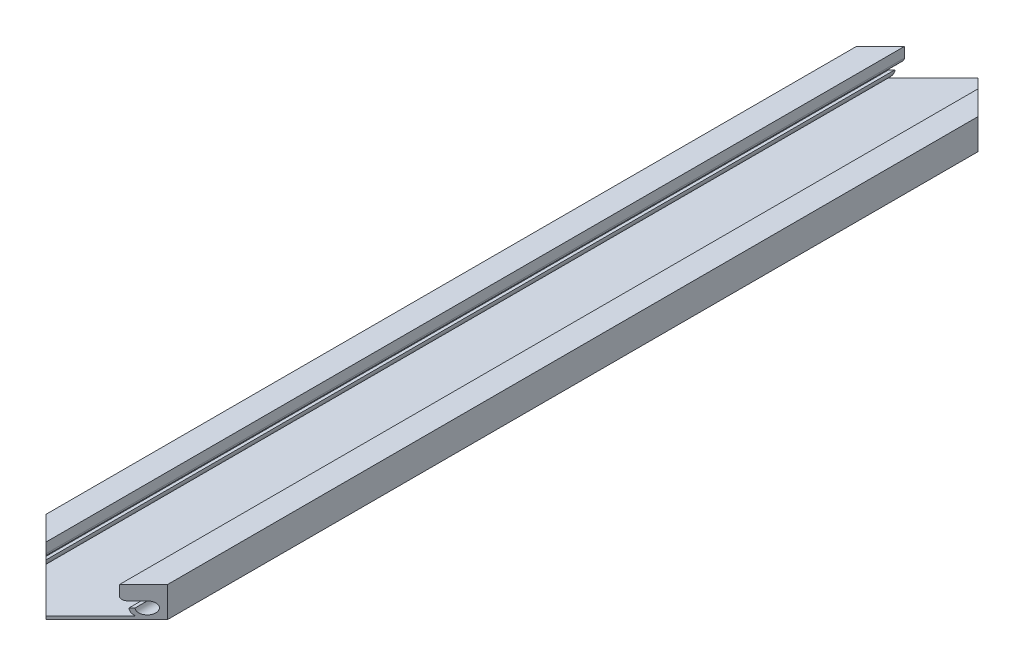
ISO-10303-21;
HEADER;
FILE_DESCRIPTION(('STEP AP214'),'2;1');
FILE_NAME('part.step','',(''),(''),'','','');
FILE_SCHEMA(('AUTOMOTIVE_DESIGN { 1 0 10303 214 1 1 1 1 }'));
ENDSEC;
DATA;
#1=APPLICATION_CONTEXT('core data for automotive mechanical design processes');
#2=APPLICATION_PROTOCOL_DEFINITION('international standard','automotive_design',2000,#1);
#3=PRODUCT_CONTEXT('',#1,'mechanical');
#4=PRODUCT('Part','Part','',(#3));
#5=PRODUCT_RELATED_PRODUCT_CATEGORY('part','',(#4));
#6=PRODUCT_DEFINITION_FORMATION('','',#4);
#7=PRODUCT_DEFINITION_CONTEXT('part definition',#1,'design');
#8=PRODUCT_DEFINITION('design','',#6,#7);
#9=PRODUCT_DEFINITION_SHAPE('','',#8);
#10=(LENGTH_UNIT() NAMED_UNIT(*) SI_UNIT(.MILLI.,.METRE.));
#11=(NAMED_UNIT(*) PLANE_ANGLE_UNIT() SI_UNIT($,.RADIAN.));
#12=(NAMED_UNIT(*) SI_UNIT($,.STERADIAN.) SOLID_ANGLE_UNIT());
#13=UNCERTAINTY_MEASURE_WITH_UNIT(LENGTH_MEASURE(1.E-05),#10,'distance_accuracy_value','');
#14=(GEOMETRIC_REPRESENTATION_CONTEXT(3) GLOBAL_UNCERTAINTY_ASSIGNED_CONTEXT((#13)) GLOBAL_UNIT_ASSIGNED_CONTEXT((#10,
#11,#12)) REPRESENTATION_CONTEXT('',''));
#15=CARTESIAN_POINT('',(0.,0.,0.));
#16=DIRECTION('',(0.,0.,1.));
#17=DIRECTION('',(1.,0.,0.));
#18=AXIS2_PLACEMENT_3D('',#15,#16,#17);
#19=CARTESIAN_POINT('',(-30.,-7.5,460.));
#20=DIRECTION('',(0.,1.,0.));
#21=DIRECTION('',(0.,0.,1.));
#22=AXIS2_PLACEMENT_3D('',#19,#20,#21);
#23=PLANE('',#22);
#24=DIRECTION('',(-0.707106781186552,0.,0.707106781186543));
#25=VECTOR('',#24,1.);
#26=CARTESIAN_POINT('',(230.,-7.5,230.000000000003));
#27=LINE('',#26,#25);
#28=CARTESIAN_POINT('',(30.,-7.5,430.000000000001));
#29=VERTEX_POINT('',#28);
#30=CARTESIAN_POINT('',(0.,-7.5,460.));
#31=VERTEX_POINT('',#30);
#32=EDGE_CURVE('E362',#29,#31,#27,.T.);
#33=ORIENTED_EDGE('',*,*,#32,.T.);
#34=DIRECTION('',(0.707106781186552,0.,0.707106781186543));
#35=VECTOR('',#34,1.);
#36=CARTESIAN_POINT('',(-230.,-7.5,230.000000000003));
#37=LINE('',#36,#35);
#38=CARTESIAN_POINT('',(-30.,-7.5,430.));
#39=VERTEX_POINT('',#38);
#40=EDGE_CURVE('E228',#39,#31,#37,.T.);
#41=ORIENTED_EDGE('',*,*,#40,.F.);
#42=DIRECTION('',(0.,0.,-1.));
#43=VECTOR('',#42,1.);
#44=CARTESIAN_POINT('',(-30.,-7.5,460.));
#45=LINE('',#44,#43);
#46=CARTESIAN_POINT('',(-30.,-7.5,29.9999999999996));
#47=VERTEX_POINT('',#46);
#48=EDGE_CURVE('E237',#39,#47,#45,.T.);
#49=ORIENTED_EDGE('',*,*,#48,.T.);
#50=DIRECTION('',(0.707106781186552,0.,-0.707106781186543));
#51=VECTOR('',#50,1.);
#52=CARTESIAN_POINT('',(0.,-7.5,0.));
#53=LINE('',#52,#51);
#54=CARTESIAN_POINT('',(0.,-7.5,0.));
#55=VERTEX_POINT('',#54);
#56=EDGE_CURVE('E366',#47,#55,#53,.T.);
#57=ORIENTED_EDGE('',*,*,#56,.T.);
#58=DIRECTION('',(-0.707106781186552,0.,-0.707106781186543));
#59=VECTOR('',#58,1.);
#60=CARTESIAN_POINT('',(0.,-7.5,0.));
#61=LINE('',#60,#59);
#62=CARTESIAN_POINT('',(30.,-7.5,29.9999999999996));
#63=VERTEX_POINT('',#62);
#64=EDGE_CURVE('E365',#63,#55,#61,.T.);
#65=ORIENTED_EDGE('',*,*,#64,.F.);
#66=DIRECTION('',(0.,0.,-1.));
#67=VECTOR('',#66,1.);
#68=CARTESIAN_POINT('',(30.,-7.5,460.));
#69=LINE('',#68,#67);
#70=EDGE_CURVE('E252',#29,#63,#69,.T.);
#71=ORIENTED_EDGE('',*,*,#70,.F.);
#72=EDGE_LOOP('',(#33,#41,#49,#57,#65,#71));
#73=FACE_BOUND('',#72,.T.);
#74=ADVANCED_FACE('F80',(#73),#23,.F.);
#75=CARTESIAN_POINT('',(22.1715728752538,-6.,460.));
#76=DIRECTION('',(0.,-1.,0.));
#77=DIRECTION('',(0.,0.,-1.));
#78=AXIS2_PLACEMENT_3D('',#75,#76,#77);
#79=PLANE('',#78);
#80=DIRECTION('',(0.,0.,-1.));
#81=VECTOR('',#80,1.);
#82=CARTESIAN_POINT('',(-22.1715728752538,-6.,460.));
#83=LINE('',#82,#81);
#84=CARTESIAN_POINT('',(-22.1715728752538,-6.,437.828427124747));
#85=VERTEX_POINT('',#84);
#86=CARTESIAN_POINT('',(-22.1715728752538,-6.,22.1715728752536));
#87=VERTEX_POINT('',#86);
#88=EDGE_CURVE('E343',#85,#87,#83,.T.);
#89=ORIENTED_EDGE('',*,*,#88,.F.);
#90=DIRECTION('',(0.707106781186552,0.,0.707106781186543));
#91=VECTOR('',#90,1.);
#92=CARTESIAN_POINT('',(11.085786437627,-6.,471.085786437627));
#93=LINE('',#92,#91);
#94=CARTESIAN_POINT('',(0.,-6.,460.));
#95=VERTEX_POINT('',#94);
#96=EDGE_CURVE('E417',#85,#95,#93,.T.);
#97=ORIENTED_EDGE('',*,*,#96,.T.);
#98=DIRECTION('',(-0.707106781186552,0.,0.707106781186543));
#99=VECTOR('',#98,1.);
#100=CARTESIAN_POINT('',(11.0857864376271,-6.,448.914213562373));
#101=LINE('',#100,#99);
#102=CARTESIAN_POINT('',(22.1715728752538,-6.,437.828427124747));
#103=VERTEX_POINT('',#102);
#104=EDGE_CURVE('E320',#103,#95,#101,.T.);
#105=ORIENTED_EDGE('',*,*,#104,.F.);
#106=DIRECTION('',(0.,0.,-1.));
#107=VECTOR('',#106,1.);
#108=CARTESIAN_POINT('',(22.1715728752538,-6.,460.));
#109=LINE('',#108,#107);
#110=CARTESIAN_POINT('',(22.1715728752538,-6.,22.1715728752536));
#111=VERTEX_POINT('',#110);
#112=EDGE_CURVE('E326',#103,#111,#109,.T.);
#113=ORIENTED_EDGE('',*,*,#112,.T.);
#114=DIRECTION('',(-0.707106781186552,0.,-0.707106781186543));
#115=VECTOR('',#114,1.);
#116=CARTESIAN_POINT('',(241.085786437627,-6.,241.085786437624));
#117=LINE('',#116,#115);
#118=CARTESIAN_POINT('',(0.,-6.,0.));
#119=VERTEX_POINT('',#118);
#120=EDGE_CURVE('E311',#111,#119,#117,.T.);
#121=ORIENTED_EDGE('',*,*,#120,.T.);
#122=DIRECTION('',(0.707106781186552,0.,-0.707106781186543));
#123=VECTOR('',#122,1.);
#124=CARTESIAN_POINT('',(-218.914213562373,-6.,218.91421356237));
#125=LINE('',#124,#123);
#126=EDGE_CURVE('E370',#87,#119,#125,.T.);
#127=ORIENTED_EDGE('',*,*,#126,.F.);
#128=EDGE_LOOP('',(#89,#97,#105,#113,#121,#127));
#129=FACE_BOUND('',#128,.T.);
#130=ADVANCED_FACE('F402',(#129),#79,.F.);
#131=CARTESIAN_POINT('',(-30.,7.5,460.));
#132=DIRECTION('',(0.,-1.,0.));
#133=DIRECTION('',(0.,0.,-1.));
#134=AXIS2_PLACEMENT_3D('',#131,#132,#133);
#135=PLANE('',#134);
#136=DIRECTION('',(0.,0.,-1.));
#137=VECTOR('',#136,1.);
#138=CARTESIAN_POINT('',(-30.,7.5,460.));
#139=LINE('',#138,#137);
#140=CARTESIAN_POINT('',(-30.,7.5,430.));
#141=VERTEX_POINT('',#140);
#142=CARTESIAN_POINT('',(-30.,7.5,29.9999999999996));
#143=VERTEX_POINT('',#142);
#144=EDGE_CURVE('E235',#141,#143,#139,.T.);
#145=ORIENTED_EDGE('',*,*,#144,.F.);
#146=DIRECTION('',(0.707106781186552,0.,0.707106781186543));
#147=VECTOR('',#146,1.);
#148=CARTESIAN_POINT('',(-230.,7.5,230.000000000003));
#149=LINE('',#148,#147);
#150=CARTESIAN_POINT('',(-18.1568883594902,7.5,441.84311164051));
#151=VERTEX_POINT('',#150);
#152=EDGE_CURVE('E216',#141,#151,#149,.T.);
#153=ORIENTED_EDGE('',*,*,#152,.T.);
#154=DIRECTION('',(0.,0.,-1.));
#155=VECTOR('',#154,1.);
#156=CARTESIAN_POINT('',(-18.1568883594903,7.5,460.));
#157=LINE('',#156,#155);
#158=CARTESIAN_POINT('',(-18.1568883594903,7.5,18.1568883594901));
#159=VERTEX_POINT('',#158);
#160=EDGE_CURVE('E323',#151,#159,#157,.T.);
#161=ORIENTED_EDGE('',*,*,#160,.T.);
#162=DIRECTION('',(0.707106781186552,0.,-0.707106781186543));
#163=VECTOR('',#162,1.);
#164=CARTESIAN_POINT('',(0.,7.5,0.));
#165=LINE('',#164,#163);
#166=EDGE_CURVE('E243',#143,#159,#165,.T.);
#167=ORIENTED_EDGE('',*,*,#166,.F.);
#168=EDGE_LOOP('',(#145,#153,#161,#167));
#169=FACE_BOUND('',#168,.T.);
#170=ADVANCED_FACE('F242',(#169),#135,.F.);
#171=CARTESIAN_POINT('',(25.,0.5,460.));
#172=DIRECTION('',(0.,1.,0.));
#173=DIRECTION('',(-1.,0.,0.));
#174=AXIS2_PLACEMENT_3D('',#171,#172,#173);
#175=PLANE('',#174);
#176=DIRECTION('',(0.,0.,-1.));
#177=VECTOR('',#176,1.);
#178=CARTESIAN_POINT('',(-20.1568883594903,0.5,460.));
#179=LINE('',#178,#177);
#180=CARTESIAN_POINT('',(-20.1568883594903,0.5,20.1568883594901));
#181=VERTEX_POINT('',#180);
#182=CARTESIAN_POINT('',(-20.1568883594903,0.5,439.84311164051));
#183=VERTEX_POINT('',#182);
#184=EDGE_CURVE('E267',#181,#183,#179,.F.);
#185=ORIENTED_EDGE('',*,*,#184,.T.);
#186=DIRECTION('',(-0.707106781186552,0.,-0.707106781186543));
#187=VECTOR('',#186,1.);
#188=CARTESIAN_POINT('',(12.5000000000001,0.5,472.5));
#189=LINE('',#188,#187);
#190=CARTESIAN_POINT('',(-25.,0.5,435.));
#191=VERTEX_POINT('',#190);
#192=EDGE_CURVE('E466',#183,#191,#189,.T.);
#193=ORIENTED_EDGE('',*,*,#192,.T.);
#194=DIRECTION('',(0.,0.,-1.));
#195=VECTOR('',#194,1.);
#196=CARTESIAN_POINT('',(-25.,0.5,460.));
#197=LINE('',#196,#195);
#198=CARTESIAN_POINT('',(-25.,0.5,24.9999999999997));
#199=VERTEX_POINT('',#198);
#200=EDGE_CURVE('E335',#191,#199,#197,.T.);
#201=ORIENTED_EDGE('',*,*,#200,.T.);
#202=DIRECTION('',(-0.707106781186552,0.,0.707106781186543));
#203=VECTOR('',#202,1.);
#204=CARTESIAN_POINT('',(-217.5,0.499999999999999,217.499999999997));
#205=LINE('',#204,#203);
#206=EDGE_CURVE('E434',#181,#199,#205,.T.);
#207=ORIENTED_EDGE('',*,*,#206,.F.);
#208=EDGE_LOOP('',(#185,#193,#201,#207));
#209=FACE_BOUND('',#208,.T.);
#210=ADVANCED_FACE('F491',(#209),#175,.F.);
#211=CARTESIAN_POINT('',(-30.,7.5,460.));
#212=DIRECTION('',(1.,0.,0.));
#213=DIRECTION('',(0.,1.,0.));
#214=AXIS2_PLACEMENT_3D('',#211,#212,#213);
#215=PLANE('',#214);
#216=ORIENTED_EDGE('',*,*,#48,.F.);
#217=DIRECTION('',(0.,-1.,0.));
#218=VECTOR('',#217,1.);
#219=CARTESIAN_POINT('',(-30.,7.5,430.));
#220=LINE('',#219,#218);
#221=EDGE_CURVE('E219',#141,#39,#220,.T.);
#222=ORIENTED_EDGE('',*,*,#221,.F.);
#223=ORIENTED_EDGE('',*,*,#144,.T.);
#224=DIRECTION('',(0.,-1.,0.));
#225=VECTOR('',#224,1.);
#226=CARTESIAN_POINT('',(-30.,7.5,29.9999999999996));
#227=LINE('',#226,#225);
#228=EDGE_CURVE('E453',#143,#47,#227,.T.);
#229=ORIENTED_EDGE('',*,*,#228,.T.);
#230=EDGE_LOOP('',(#216,#222,#223,#229));
#231=FACE_BOUND('',#230,.T.);
#232=ADVANCED_FACE('F233',(#231),#215,.F.);
#233=CARTESIAN_POINT('',(-25.,-2.5,460.));
#234=DIRECTION('',(0.,0.,-1.));
#235=DIRECTION('',(-1.,0.,0.));
#236=AXIS2_PLACEMENT_3D('',#233,#234,#235);
#237=CYLINDRICAL_SURFACE('',#236,3.);
#238=ORIENTED_EDGE('',*,*,#200,.F.);
#239=CARTESIAN_POINT('',(-25.,-2.5,435.));
#240=DIRECTION('',(0.707106781186543,0.,-0.707106781186552));
#241=DIRECTION('',(-0.707106781186552,0.,-0.707106781186543));
#242=AXIS2_PLACEMENT_3D('',#239,#240,#241);
#243=ELLIPSE('',#242,4.24264068711926,3.);
#244=CARTESIAN_POINT('',(-22.,-2.5,438.));
#245=VERTEX_POINT('',#244);
#246=EDGE_CURVE('E470',#191,#245,#243,.F.);
#247=ORIENTED_EDGE('',*,*,#246,.T.);
#248=DIRECTION('',(0.,0.,-1.));
#249=VECTOR('',#248,1.);
#250=CARTESIAN_POINT('',(-22.,-2.5,460.));
#251=LINE('',#250,#249);
#252=CARTESIAN_POINT('',(-22.,-2.5,21.9999999999999));
#253=VERTEX_POINT('',#252);
#254=EDGE_CURVE('E259',#245,#253,#251,.T.);
#255=ORIENTED_EDGE('',*,*,#254,.T.);
#256=CARTESIAN_POINT('',(-25.,-2.5,24.9999999999997));
#257=DIRECTION('',(-0.707106781186543,0.,-0.707106781186552));
#258=DIRECTION('',(0.707106781186552,0.,-0.707106781186543));
#259=AXIS2_PLACEMENT_3D('',#256,#257,#258);
#260=ELLIPSE('',#259,4.24264068711927,3.);
#261=EDGE_CURVE('E437',#199,#253,#260,.F.);
#262=ORIENTED_EDGE('',*,*,#261,.F.);
#263=EDGE_LOOP('',(#238,#247,#255,#262));
#264=FACE_BOUND('',#263,.T.);
#265=ADVANCED_FACE('F488',(#264),#237,.F.);
#266=CARTESIAN_POINT('',(-25.,-2.5,460.));
#267=DIRECTION('',(0.,-1.,0.));
#268=DIRECTION('',(1.,0.,0.));
#269=AXIS2_PLACEMENT_3D('',#266,#267,#268);
#270=PLANE('',#269);
#271=ORIENTED_EDGE('',*,*,#254,.F.);
#272=DIRECTION('',(0.707106781186552,0.,0.707106781186543));
#273=VECTOR('',#272,1.);
#274=CARTESIAN_POINT('',(-12.5000000000002,-2.5,447.5));
#275=LINE('',#274,#273);
#276=CARTESIAN_POINT('',(-20.5,-2.5,439.5));
#277=VERTEX_POINT('',#276);
#278=EDGE_CURVE('E428',#245,#277,#275,.T.);
#279=ORIENTED_EDGE('',*,*,#278,.T.);
#280=DIRECTION('',(0.,0.,-1.));
#281=VECTOR('',#280,1.);
#282=CARTESIAN_POINT('',(-20.5,-2.5,460.));
#283=LINE('',#282,#281);
#284=CARTESIAN_POINT('',(-20.5,-2.5,20.4999999999998));
#285=VERTEX_POINT('',#284);
#286=EDGE_CURVE('E339',#277,#285,#283,.T.);
#287=ORIENTED_EDGE('',*,*,#286,.T.);
#288=DIRECTION('',(0.707106781186552,0.,-0.707106781186543));
#289=VECTOR('',#288,1.);
#290=CARTESIAN_POINT('',(-242.5,-2.49999999999994,242.499999999997));
#291=LINE('',#290,#289);
#292=EDGE_CURVE('E440',#253,#285,#291,.T.);
#293=ORIENTED_EDGE('',*,*,#292,.F.);
#294=EDGE_LOOP('',(#271,#279,#287,#293));
#295=FACE_BOUND('',#294,.T.);
#296=ADVANCED_FACE('F478',(#295),#270,.F.);
#297=CARTESIAN_POINT('',(-25.,-2.5,460.));
#298=DIRECTION('',(0.,0.,-1.));
#299=DIRECTION('',(-1.,0.,0.));
#300=AXIS2_PLACEMENT_3D('',#297,#298,#299);
#301=CYLINDRICAL_SURFACE('',#300,4.5);
#302=ORIENTED_EDGE('',*,*,#286,.F.);
#303=CARTESIAN_POINT('',(-25.,-2.5,435.));
#304=DIRECTION('',(0.707106781186543,0.,-0.707106781186552));
#305=DIRECTION('',(-0.707106781186552,0.,-0.707106781186543));
#306=AXIS2_PLACEMENT_3D('',#303,#304,#305);
#307=ELLIPSE('',#306,6.36396103067889,4.5);
#308=EDGE_CURVE('E421',#277,#85,#307,.T.);
#309=ORIENTED_EDGE('',*,*,#308,.T.);
#310=ORIENTED_EDGE('',*,*,#88,.T.);
#311=CARTESIAN_POINT('',(-25.,-2.5,24.9999999999997));
#312=DIRECTION('',(-0.707106781186543,0.,-0.707106781186552));
#313=DIRECTION('',(0.707106781186552,0.,-0.707106781186543));
#314=AXIS2_PLACEMENT_3D('',#311,#312,#313);
#315=ELLIPSE('',#314,6.3639610306789,4.5);
#316=EDGE_CURVE('E375',#285,#87,#315,.T.);
#317=ORIENTED_EDGE('',*,*,#316,.F.);
#318=EDGE_LOOP('',(#302,#309,#310,#317));
#319=FACE_BOUND('',#318,.T.);
#320=ADVANCED_FACE('F482',(#319),#301,.T.);
#321=CARTESIAN_POINT('',(-18.1568883594903,7.5,460.));
#322=DIRECTION('',(-1.,0.,0.));
#323=DIRECTION('',(0.,0.,1.));
#324=AXIS2_PLACEMENT_3D('',#321,#322,#323);
#325=PLANE('',#324);
#326=ORIENTED_EDGE('',*,*,#160,.F.);
#327=DIRECTION('',(0.,-1.,0.));
#328=VECTOR('',#327,1.);
#329=CARTESIAN_POINT('',(-18.1568883594903,7.5,441.84311164051));
#330=LINE('',#329,#328);
#331=CARTESIAN_POINT('',(-18.1568883594903,2.5,441.84311164051));
#332=VERTEX_POINT('',#331);
#333=EDGE_CURVE('E222',#151,#332,#330,.T.);
#334=ORIENTED_EDGE('',*,*,#333,.T.);
#335=DIRECTION('',(0.,0.,-1.));
#336=VECTOR('',#335,1.);
#337=CARTESIAN_POINT('',(-18.1568883594903,2.5,460.));
#338=LINE('',#337,#336);
#339=CARTESIAN_POINT('',(-18.1568883594903,2.5,18.1568883594901));
#340=VERTEX_POINT('',#339);
#341=EDGE_CURVE('E263',#332,#340,#338,.T.);
#342=ORIENTED_EDGE('',*,*,#341,.T.);
#343=DIRECTION('',(0.,-1.,0.));
#344=VECTOR('',#343,1.);
#345=CARTESIAN_POINT('',(-18.1568883594903,7.5,18.1568883594901));
#346=LINE('',#345,#344);
#347=EDGE_CURVE('E426',#159,#340,#346,.T.);
#348=ORIENTED_EDGE('',*,*,#347,.F.);
#349=EDGE_LOOP('',(#326,#334,#342,#348));
#350=FACE_BOUND('',#349,.T.);
#351=ADVANCED_FACE('F498',(#350),#325,.F.);
#352=CARTESIAN_POINT('',(-20.1568883594903,2.5,460.));
#353=DIRECTION('',(0.,0.,-1.));
#354=DIRECTION('',(-1.,0.,0.));
#355=AXIS2_PLACEMENT_3D('',#352,#353,#354);
#356=CYLINDRICAL_SURFACE('',#355,2.);
#357=CARTESIAN_POINT('',(-20.1568883594903,2.5,439.84311164051));
#358=DIRECTION('',(0.707106781186543,0.,-0.707106781186552));
#359=DIRECTION('',(-0.707106781186552,0.,-0.707106781186543));
#360=AXIS2_PLACEMENT_3D('',#357,#358,#359);
#361=ELLIPSE('',#360,2.82842712474617,2.);
#362=EDGE_CURVE('E239',#183,#332,#361,.F.);
#363=ORIENTED_EDGE('',*,*,#362,.F.);
#364=ORIENTED_EDGE('',*,*,#184,.F.);
#365=CARTESIAN_POINT('',(-20.1568883594903,2.5,20.1568883594901));
#366=DIRECTION('',(-0.707106781186543,0.,-0.707106781186552));
#367=DIRECTION('',(0.707106781186552,0.,-0.707106781186543));
#368=AXIS2_PLACEMENT_3D('',#365,#366,#367);
#369=ELLIPSE('',#368,2.82842712474617,2.);
#370=EDGE_CURVE('E420',#181,#340,#369,.F.);
#371=ORIENTED_EDGE('',*,*,#370,.T.);
#372=ORIENTED_EDGE('',*,*,#341,.F.);
#373=EDGE_LOOP('',(#363,#364,#371,#372));
#374=FACE_BOUND('',#373,.T.);
#375=ADVANCED_FACE('F495',(#374),#356,.T.);
#376=CARTESIAN_POINT('',(30.,7.5,460.));
#377=DIRECTION('',(-1.,0.,0.));
#378=DIRECTION('',(0.,-1.,0.));
#379=AXIS2_PLACEMENT_3D('',#376,#377,#378);
#380=PLANE('',#379);
#381=DIRECTION('',(0.,-1.,0.));
#382=VECTOR('',#381,1.);
#383=CARTESIAN_POINT('',(30.,7.5,430.000000000001));
#384=LINE('',#383,#382);
#385=CARTESIAN_POINT('',(30.,7.5,430.000000000001));
#386=VERTEX_POINT('',#385);
#387=EDGE_CURVE('E358',#386,#29,#384,.T.);
#388=ORIENTED_EDGE('',*,*,#387,.T.);
#389=ORIENTED_EDGE('',*,*,#70,.T.);
#390=DIRECTION('',(0.,-1.,0.));
#391=VECTOR('',#390,1.);
#392=CARTESIAN_POINT('',(30.,7.5,29.9999999999996));
#393=LINE('',#392,#391);
#394=CARTESIAN_POINT('',(30.,7.5,29.9999999999996));
#395=VERTEX_POINT('',#394);
#396=EDGE_CURVE('E357',#395,#63,#393,.T.);
#397=ORIENTED_EDGE('',*,*,#396,.F.);
#398=DIRECTION('',(0.,0.,-1.));
#399=VECTOR('',#398,1.);
#400=CARTESIAN_POINT('',(30.,7.5,460.));
#401=LINE('',#400,#399);
#402=EDGE_CURVE('E245',#386,#395,#401,.T.);
#403=ORIENTED_EDGE('',*,*,#402,.F.);
#404=EDGE_LOOP('',(#388,#389,#397,#403));
#405=FACE_BOUND('',#404,.T.);
#406=ADVANCED_FACE('F355',(#405),#380,.F.);
#407=DIRECTION('',(-0.707106781186552,0.,0.707106781186543));
#408=VECTOR('',#407,1.);
#409=CARTESIAN_POINT('',(230.,7.5,230.000000000003));
#410=LINE('',#409,#408);
#411=CARTESIAN_POINT('',(18.1431116405097,7.5,441.856888359491));
#412=VERTEX_POINT('',#411);
#413=EDGE_CURVE('E445',#386,#412,#410,.T.);
#414=ORIENTED_EDGE('',*,*,#413,.F.);
#415=ORIENTED_EDGE('',*,*,#402,.T.);
#416=DIRECTION('',(-0.707106781186552,0.,-0.707106781186543));
#417=VECTOR('',#416,1.);
#418=CARTESIAN_POINT('',(0.,7.5,0.));
#419=LINE('',#418,#417);
#420=CARTESIAN_POINT('',(18.1431116405097,7.5,18.1431116405095));
#421=VERTEX_POINT('',#420);
#422=EDGE_CURVE('E369',#395,#421,#419,.T.);
#423=ORIENTED_EDGE('',*,*,#422,.T.);
#424=DIRECTION('',(0.,0.,-1.));
#425=VECTOR('',#424,1.);
#426=CARTESIAN_POINT('',(18.1431116405097,7.5,460.));
#427=LINE('',#426,#425);
#428=EDGE_CURVE('E290',#412,#421,#427,.T.);
#429=ORIENTED_EDGE('',*,*,#428,.F.);
#430=EDGE_LOOP('',(#414,#415,#423,#429));
#431=FACE_BOUND('',#430,.T.);
#432=ADVANCED_FACE('F520',(#431),#135,.F.);
#433=CARTESIAN_POINT('',(25.,-2.5,460.));
#434=DIRECTION('',(0.,0.,-1.));
#435=DIRECTION('',(-1.,0.,0.));
#436=AXIS2_PLACEMENT_3D('',#433,#434,#435);
#437=CYLINDRICAL_SURFACE('',#436,3.);
#438=CARTESIAN_POINT('',(25.,-2.5,435.));
#439=DIRECTION('',(0.707106781186543,0.,0.707106781186552));
#440=DIRECTION('',(0.707106781186552,0.,-0.707106781186543));
#441=AXIS2_PLACEMENT_3D('',#438,#439,#440);
#442=ELLIPSE('',#441,4.24264068711926,3.);
#443=CARTESIAN_POINT('',(25.,0.5,435.));
#444=VERTEX_POINT('',#443);
#445=CARTESIAN_POINT('',(22.,-2.5,438.));
#446=VERTEX_POINT('',#445);
#447=EDGE_CURVE('E305',#444,#446,#442,.F.);
#448=ORIENTED_EDGE('',*,*,#447,.F.);
#449=DIRECTION('',(0.,0.,-1.));
#450=VECTOR('',#449,1.);
#451=CARTESIAN_POINT('',(25.,0.5,460.));
#452=LINE('',#451,#450);
#453=CARTESIAN_POINT('',(25.,0.5,24.9999999999997));
#454=VERTEX_POINT('',#453);
#455=EDGE_CURVE('E303',#444,#454,#452,.T.);
#456=ORIENTED_EDGE('',*,*,#455,.T.);
#457=CARTESIAN_POINT('',(25.,-2.5,24.9999999999997));
#458=DIRECTION('',(-0.707106781186543,0.,0.707106781186552));
#459=DIRECTION('',(-0.707106781186552,0.,-0.707106781186543));
#460=AXIS2_PLACEMENT_3D('',#457,#458,#459);
#461=ELLIPSE('',#460,4.24264068711926,3.);
#462=CARTESIAN_POINT('',(22.,-2.5,21.9999999999998));
#463=VERTEX_POINT('',#462);
#464=EDGE_CURVE('E386',#454,#463,#461,.F.);
#465=ORIENTED_EDGE('',*,*,#464,.T.);
#466=DIRECTION('',(0.,0.,-1.));
#467=VECTOR('',#466,1.);
#468=CARTESIAN_POINT('',(22.,-2.5,460.));
#469=LINE('',#468,#467);
#470=EDGE_CURVE('E250',#463,#446,#469,.F.);
#471=ORIENTED_EDGE('',*,*,#470,.T.);
#472=EDGE_LOOP('',(#448,#456,#465,#471));
#473=FACE_BOUND('',#472,.T.);
#474=ADVANCED_FACE('F414',(#473),#437,.F.);
#475=DIRECTION('',(0.707106781186552,0.,-0.707106781186543));
#476=VECTOR('',#475,1.);
#477=CARTESIAN_POINT('',(12.5000000000002,0.5,447.5));
#478=LINE('',#477,#476);
#479=CARTESIAN_POINT('',(20.1431116405097,0.5,439.856888359491));
#480=VERTEX_POINT('',#479);
#481=EDGE_CURVE('E297',#480,#444,#478,.T.);
#482=ORIENTED_EDGE('',*,*,#481,.F.);
#483=DIRECTION('',(0.,0.,-1.));
#484=VECTOR('',#483,1.);
#485=CARTESIAN_POINT('',(20.1431116405097,0.5,460.));
#486=LINE('',#485,#484);
#487=CARTESIAN_POINT('',(20.1431116405097,0.5,20.1431116405095));
#488=VERTEX_POINT('',#487);
#489=EDGE_CURVE('E271',#480,#488,#486,.T.);
#490=ORIENTED_EDGE('',*,*,#489,.T.);
#491=DIRECTION('',(0.707106781186552,0.,0.707106781186543));
#492=VECTOR('',#491,1.);
#493=CARTESIAN_POINT('',(242.5,0.500000000000001,242.499999999997));
#494=LINE('',#493,#492);
#495=EDGE_CURVE('E96',#488,#454,#494,.T.);
#496=ORIENTED_EDGE('',*,*,#495,.T.);
#497=ORIENTED_EDGE('',*,*,#455,.F.);
#498=EDGE_LOOP('',(#482,#490,#496,#497));
#499=FACE_BOUND('',#498,.T.);
#500=ADVANCED_FACE('F301',(#499),#175,.F.);
#501=CARTESIAN_POINT('',(20.5,-2.5,460.));
#502=DIRECTION('',(0.,-1.,0.));
#503=DIRECTION('',(1.,0.,0.));
#504=AXIS2_PLACEMENT_3D('',#501,#502,#503);
#505=PLANE('',#504);
#506=DIRECTION('',(-0.707106781186552,0.,0.707106781186543));
#507=VECTOR('',#506,1.);
#508=CARTESIAN_POINT('',(10.2500000000002,-2.5,449.75));
#509=LINE('',#508,#507);
#510=CARTESIAN_POINT('',(20.5,-2.5,439.5));
#511=VERTEX_POINT('',#510);
#512=EDGE_CURVE('E309',#446,#511,#509,.T.);
#513=ORIENTED_EDGE('',*,*,#512,.F.);
#514=ORIENTED_EDGE('',*,*,#470,.F.);
#515=DIRECTION('',(-0.707106781186552,0.,-0.707106781186543));
#516=VECTOR('',#515,1.);
#517=CARTESIAN_POINT('',(240.25,-2.50000000000002,240.249999999997));
#518=LINE('',#517,#516);
#519=CARTESIAN_POINT('',(20.5,-2.5,20.4999999999998));
#520=VERTEX_POINT('',#519);
#521=EDGE_CURVE('E390',#463,#520,#518,.T.);
#522=ORIENTED_EDGE('',*,*,#521,.T.);
#523=DIRECTION('',(0.,0.,-1.));
#524=VECTOR('',#523,1.);
#525=CARTESIAN_POINT('',(20.5,-2.5,460.));
#526=LINE('',#525,#524);
#527=EDGE_CURVE('E329',#511,#520,#526,.T.);
#528=ORIENTED_EDGE('',*,*,#527,.F.);
#529=EDGE_LOOP('',(#513,#514,#522,#528));
#530=FACE_BOUND('',#529,.T.);
#531=ADVANCED_FACE('F411',(#530),#505,.F.);
#532=CARTESIAN_POINT('',(25.,-2.5,460.));
#533=DIRECTION('',(0.,0.,-1.));
#534=DIRECTION('',(-1.,0.,0.));
#535=AXIS2_PLACEMENT_3D('',#532,#533,#534);
#536=CYLINDRICAL_SURFACE('',#535,4.5);
#537=CARTESIAN_POINT('',(25.,-2.5,435.));
#538=DIRECTION('',(0.707106781186543,0.,0.707106781186552));
#539=DIRECTION('',(0.707106781186552,0.,-0.707106781186543));
#540=AXIS2_PLACEMENT_3D('',#537,#538,#539);
#541=ELLIPSE('',#540,6.36396103067889,4.5);
#542=EDGE_CURVE('E317',#511,#103,#541,.T.);
#543=ORIENTED_EDGE('',*,*,#542,.F.);
#544=ORIENTED_EDGE('',*,*,#527,.T.);
#545=CARTESIAN_POINT('',(25.,-2.5,24.9999999999997));
#546=DIRECTION('',(-0.707106781186543,0.,0.707106781186552));
#547=DIRECTION('',(-0.707106781186552,0.,-0.707106781186543));
#548=AXIS2_PLACEMENT_3D('',#545,#546,#547);
#549=ELLIPSE('',#548,6.36396103067889,4.5);
#550=EDGE_CURVE('E394',#520,#111,#549,.T.);
#551=ORIENTED_EDGE('',*,*,#550,.T.);
#552=ORIENTED_EDGE('',*,*,#112,.F.);
#553=EDGE_LOOP('',(#543,#544,#551,#552));
#554=FACE_BOUND('',#553,.T.);
#555=ADVANCED_FACE('F407',(#554),#536,.T.);
#556=CARTESIAN_POINT('',(18.1431116405097,0.5,460.));
#557=DIRECTION('',(1.,0.,0.));
#558=DIRECTION('',(0.,0.,-1.));
#559=AXIS2_PLACEMENT_3D('',#556,#557,#558);
#560=PLANE('',#559);
#561=DIRECTION('',(0.,-1.,0.));
#562=VECTOR('',#561,1.);
#563=CARTESIAN_POINT('',(18.1431116405097,0.5,441.856888359491));
#564=LINE('',#563,#562);
#565=CARTESIAN_POINT('',(18.1431116405097,2.5,441.856888359491));
#566=VERTEX_POINT('',#565);
#567=EDGE_CURVE('E104',#412,#566,#564,.T.);
#568=ORIENTED_EDGE('',*,*,#567,.F.);
#569=ORIENTED_EDGE('',*,*,#428,.T.);
#570=DIRECTION('',(0.,-1.,0.));
#571=VECTOR('',#570,1.);
#572=CARTESIAN_POINT('',(18.1431116405097,0.5,18.1431116405095));
#573=LINE('',#572,#571);
#574=CARTESIAN_POINT('',(18.1431116405097,2.5,18.1431116405095));
#575=VERTEX_POINT('',#574);
#576=EDGE_CURVE('E281',#421,#575,#573,.T.);
#577=ORIENTED_EDGE('',*,*,#576,.T.);
#578=DIRECTION('',(0.,0.,-1.));
#579=VECTOR('',#578,1.);
#580=CARTESIAN_POINT('',(18.1431116405097,2.5,460.));
#581=LINE('',#580,#579);
#582=EDGE_CURVE('E275',#575,#566,#581,.F.);
#583=ORIENTED_EDGE('',*,*,#582,.T.);
#584=EDGE_LOOP('',(#568,#569,#577,#583));
#585=FACE_BOUND('',#584,.T.);
#586=ADVANCED_FACE('F288',(#585),#560,.F.);
#587=CARTESIAN_POINT('',(20.1431116405097,2.5,460.));
#588=DIRECTION('',(0.,0.,-1.));
#589=DIRECTION('',(-1.,0.,0.));
#590=AXIS2_PLACEMENT_3D('',#587,#588,#589);
#591=CYLINDRICAL_SURFACE('',#590,2.);
#592=ORIENTED_EDGE('',*,*,#489,.F.);
#593=CARTESIAN_POINT('',(20.1431116405097,2.5,439.856888359491));
#594=DIRECTION('',(0.707106781186543,0.,0.707106781186552));
#595=DIRECTION('',(0.707106781186552,0.,-0.707106781186543));
#596=AXIS2_PLACEMENT_3D('',#593,#594,#595);
#597=ELLIPSE('',#596,2.82842712474617,2.);
#598=EDGE_CURVE('E12',#480,#566,#597,.F.);
#599=ORIENTED_EDGE('',*,*,#598,.T.);
#600=ORIENTED_EDGE('',*,*,#582,.F.);
#601=CARTESIAN_POINT('',(20.1431116405097,2.5,20.1431116405095));
#602=DIRECTION('',(-0.707106781186543,0.,0.707106781186552));
#603=DIRECTION('',(-0.707106781186552,0.,-0.707106781186543));
#604=AXIS2_PLACEMENT_3D('',#601,#602,#603);
#605=ELLIPSE('',#604,2.82842712474617,2.);
#606=EDGE_CURVE('E89',#488,#575,#605,.F.);
#607=ORIENTED_EDGE('',*,*,#606,.F.);
#608=EDGE_LOOP('',(#592,#599,#600,#607));
#609=FACE_BOUND('',#608,.T.);
#610=ADVANCED_FACE('F82',(#609),#591,.T.);
#611=CARTESIAN_POINT('',(0.,7.5,0.));
#612=DIRECTION('',(-0.707106781186543,0.,0.707106781186552));
#613=DIRECTION('',(0.707106781186552,0.,0.707106781186543));
#614=AXIS2_PLACEMENT_3D('',#611,#612,#613);
#615=PLANE('',#614);
#616=ORIENTED_EDGE('',*,*,#550,.F.);
#617=ORIENTED_EDGE('',*,*,#521,.F.);
#618=ORIENTED_EDGE('',*,*,#464,.F.);
#619=ORIENTED_EDGE('',*,*,#495,.F.);
#620=ORIENTED_EDGE('',*,*,#606,.T.);
#621=ORIENTED_EDGE('',*,*,#576,.F.);
#622=ORIENTED_EDGE('',*,*,#422,.F.);
#623=ORIENTED_EDGE('',*,*,#396,.T.);
#624=ORIENTED_EDGE('',*,*,#64,.T.);
#625=DIRECTION('',(0.,-1.,0.));
#626=VECTOR('',#625,1.);
#627=CARTESIAN_POINT('',(0.,7.5,0.));
#628=LINE('',#627,#626);
#629=EDGE_CURVE('E379',#119,#55,#628,.T.);
#630=ORIENTED_EDGE('',*,*,#629,.F.);
#631=ORIENTED_EDGE('',*,*,#120,.F.);
#632=EDGE_LOOP('',(#616,#617,#618,#619,#620,#621,#622,#623,#624,#630,#631));
#633=FACE_BOUND('',#632,.T.);
#634=ADVANCED_FACE('F280',(#633),#615,.F.);
#635=CARTESIAN_POINT('',(230.,7.5,230.000000000003));
#636=DIRECTION('',(0.707106781186543,0.,0.707106781186552));
#637=DIRECTION('',(0.707106781186552,0.,-0.707106781186543));
#638=AXIS2_PLACEMENT_3D('',#635,#636,#637);
#639=PLANE('',#638);
#640=ORIENTED_EDGE('',*,*,#104,.T.);
#641=DIRECTION('',(0.,-1.,0.));
#642=VECTOR('',#641,1.);
#643=CARTESIAN_POINT('',(0.,7.5,460.));
#644=LINE('',#643,#642);
#645=EDGE_CURVE('E292',#95,#31,#644,.T.);
#646=ORIENTED_EDGE('',*,*,#645,.T.);
#647=ORIENTED_EDGE('',*,*,#32,.F.);
#648=ORIENTED_EDGE('',*,*,#387,.F.);
#649=ORIENTED_EDGE('',*,*,#413,.T.);
#650=ORIENTED_EDGE('',*,*,#567,.T.);
#651=ORIENTED_EDGE('',*,*,#598,.F.);
#652=ORIENTED_EDGE('',*,*,#481,.T.);
#653=ORIENTED_EDGE('',*,*,#447,.T.);
#654=ORIENTED_EDGE('',*,*,#512,.T.);
#655=ORIENTED_EDGE('',*,*,#542,.T.);
#656=EDGE_LOOP('',(#640,#646,#647,#648,#649,#650,#651,#652,#653,#654,#655));
#657=FACE_BOUND('',#656,.T.);
#658=ADVANCED_FACE('F296',(#657),#639,.T.);
#659=CARTESIAN_POINT('',(-230.,7.5,230.000000000003));
#660=DIRECTION('',(0.707106781186543,0.,-0.707106781186552));
#661=DIRECTION('',(-0.707106781186552,0.,-0.707106781186543));
#662=AXIS2_PLACEMENT_3D('',#659,#660,#661);
#663=PLANE('',#662);
#664=ORIENTED_EDGE('',*,*,#308,.F.);
#665=ORIENTED_EDGE('',*,*,#278,.F.);
#666=ORIENTED_EDGE('',*,*,#246,.F.);
#667=ORIENTED_EDGE('',*,*,#192,.F.);
#668=ORIENTED_EDGE('',*,*,#362,.T.);
#669=ORIENTED_EDGE('',*,*,#333,.F.);
#670=ORIENTED_EDGE('',*,*,#152,.F.);
#671=ORIENTED_EDGE('',*,*,#221,.T.);
#672=ORIENTED_EDGE('',*,*,#40,.T.);
#673=ORIENTED_EDGE('',*,*,#645,.F.);
#674=ORIENTED_EDGE('',*,*,#96,.F.);
#675=EDGE_LOOP('',(#664,#665,#666,#667,#668,#669,#670,#671,#672,#673,#674));
#676=FACE_BOUND('',#675,.T.);
#677=ADVANCED_FACE('F218',(#676),#663,.F.);
#678=CARTESIAN_POINT('',(0.,7.5,0.));
#679=DIRECTION('',(-0.707106781186543,0.,-0.707106781186552));
#680=DIRECTION('',(-0.707106781186552,0.,0.707106781186543));
#681=AXIS2_PLACEMENT_3D('',#678,#679,#680);
#682=PLANE('',#681);
#683=ORIENTED_EDGE('',*,*,#126,.T.);
#684=ORIENTED_EDGE('',*,*,#629,.T.);
#685=ORIENTED_EDGE('',*,*,#56,.F.);
#686=ORIENTED_EDGE('',*,*,#228,.F.);
#687=ORIENTED_EDGE('',*,*,#166,.T.);
#688=ORIENTED_EDGE('',*,*,#347,.T.);
#689=ORIENTED_EDGE('',*,*,#370,.F.);
#690=ORIENTED_EDGE('',*,*,#206,.T.);
#691=ORIENTED_EDGE('',*,*,#261,.T.);
#692=ORIENTED_EDGE('',*,*,#292,.T.);
#693=ORIENTED_EDGE('',*,*,#316,.T.);
#694=EDGE_LOOP('',(#683,#684,#685,#686,#687,#688,#689,#690,#691,#692,#693));
#695=FACE_BOUND('',#694,.T.);
#696=ADVANCED_FACE('F484',(#695),#682,.T.);
#697=CLOSED_SHELL('',(#74,#130,#170,#210,#232,#265,#296,#320,#351,#375,#406,#432,#474,#500,#531,
#555,#586,#610,#634,#658,#677,#696));
#698=MANIFOLD_SOLID_BREP('B2',#697);
#699=ADVANCED_BREP_SHAPE_REPRESENTATION('',(#18,#698),#14);
#700=SHAPE_DEFINITION_REPRESENTATION(#9,#699);
ENDSEC;
END-ISO-10303-21;
